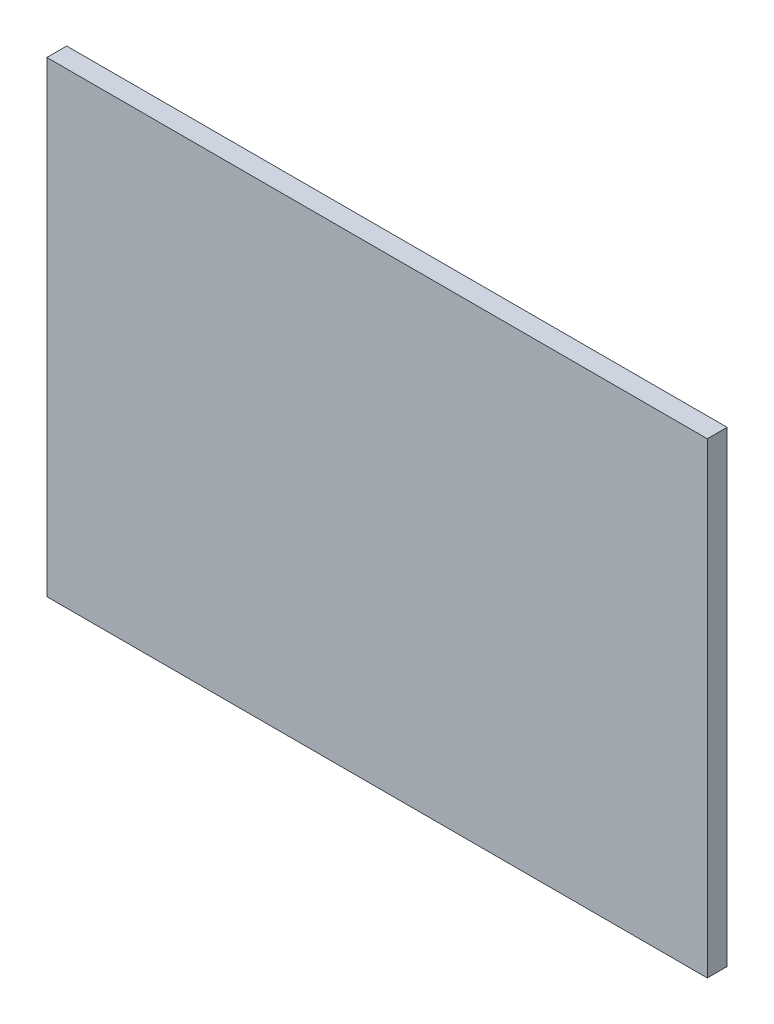
ISO-10303-21;
HEADER;
FILE_DESCRIPTION(('STEP AP214'),'2;1');
FILE_NAME('part.step','',(''),(''),'','','');
FILE_SCHEMA(('AUTOMOTIVE_DESIGN { 1 0 10303 214 1 1 1 1 }'));
ENDSEC;
DATA;
#1=APPLICATION_CONTEXT('core data for automotive mechanical design processes');
#2=APPLICATION_PROTOCOL_DEFINITION('international standard','automotive_design',2000,#1);
#3=PRODUCT_CONTEXT('',#1,'mechanical');
#4=PRODUCT('Part','Part','',(#3));
#5=PRODUCT_RELATED_PRODUCT_CATEGORY('part','',(#4));
#6=PRODUCT_DEFINITION_FORMATION('','',#4);
#7=PRODUCT_DEFINITION_CONTEXT('part definition',#1,'design');
#8=PRODUCT_DEFINITION('design','',#6,#7);
#9=PRODUCT_DEFINITION_SHAPE('','',#8);
#10=(LENGTH_UNIT() NAMED_UNIT(*) SI_UNIT(.MILLI.,.METRE.));
#11=(NAMED_UNIT(*) PLANE_ANGLE_UNIT() SI_UNIT($,.RADIAN.));
#12=(NAMED_UNIT(*) SI_UNIT($,.STERADIAN.) SOLID_ANGLE_UNIT());
#13=UNCERTAINTY_MEASURE_WITH_UNIT(LENGTH_MEASURE(1.E-05),#10,'distance_accuracy_value','');
#14=(GEOMETRIC_REPRESENTATION_CONTEXT(3) GLOBAL_UNCERTAINTY_ASSIGNED_CONTEXT((#13)) GLOBAL_UNIT_ASSIGNED_CONTEXT((#10,
#11,#12)) REPRESENTATION_CONTEXT('',''));
#15=CARTESIAN_POINT('',(0.,0.,0.));
#16=DIRECTION('',(0.,0.,1.));
#17=DIRECTION('',(1.,0.,0.));
#18=AXIS2_PLACEMENT_3D('',#15,#16,#17);
#19=CARTESIAN_POINT('',(15.,110.707070707071,3.));
#20=DIRECTION('',(1.,0.,0.));
#21=DIRECTION('',(0.,1.,0.));
#22=AXIS2_PLACEMENT_3D('',#19,#20,#21);
#23=PLANE('',#22);
#24=DIRECTION('',(0.,-1.,0.));
#25=VECTOR('',#24,1.);
#26=CARTESIAN_POINT('',(15.,110.707070707071,0.));
#27=LINE('',#26,#25);
#28=CARTESIAN_POINT('',(15.,110.707070707071,0.));
#29=VERTEX_POINT('',#28);
#30=CARTESIAN_POINT('',(15.,40.,0.));
#31=VERTEX_POINT('',#30);
#32=EDGE_CURVE('E101',#29,#31,#27,.T.);
#33=ORIENTED_EDGE('',*,*,#32,.T.);
#34=DIRECTION('',(0.,0.,-1.));
#35=VECTOR('',#34,1.);
#36=CARTESIAN_POINT('',(15.,40.,3.));
#37=LINE('',#36,#35);
#38=CARTESIAN_POINT('',(15.,40.,3.));
#39=VERTEX_POINT('',#38);
#40=EDGE_CURVE('E11',#39,#31,#37,.T.);
#41=ORIENTED_EDGE('',*,*,#40,.F.);
#42=DIRECTION('',(0.,-1.,0.));
#43=VECTOR('',#42,1.);
#44=CARTESIAN_POINT('',(15.,110.707070707071,3.));
#45=LINE('',#44,#43);
#46=CARTESIAN_POINT('',(15.,110.707070707071,3.));
#47=VERTEX_POINT('',#46);
#48=EDGE_CURVE('E89',#47,#39,#45,.T.);
#49=ORIENTED_EDGE('',*,*,#48,.F.);
#50=DIRECTION('',(0.,0.,-1.));
#51=VECTOR('',#50,1.);
#52=CARTESIAN_POINT('',(15.,110.707070707071,3.));
#53=LINE('',#52,#51);
#54=EDGE_CURVE('E97',#47,#29,#53,.T.);
#55=ORIENTED_EDGE('',*,*,#54,.T.);
#56=EDGE_LOOP('',(#33,#41,#49,#55));
#57=FACE_BOUND('',#56,.T.);
#58=ADVANCED_FACE('F38',(#57),#23,.F.);
#59=CARTESIAN_POINT('',(15.,40.,3.));
#60=DIRECTION('',(0.,1.,0.));
#61=DIRECTION('',(0.,0.,1.));
#62=AXIS2_PLACEMENT_3D('',#59,#60,#61);
#63=PLANE('',#62);
#64=DIRECTION('',(1.,0.,0.));
#65=VECTOR('',#64,1.);
#66=CARTESIAN_POINT('',(15.,40.,0.));
#67=LINE('',#66,#65);
#68=CARTESIAN_POINT('',(115.,40.,0.));
#69=VERTEX_POINT('',#68);
#70=EDGE_CURVE('E93',#31,#69,#67,.T.);
#71=ORIENTED_EDGE('',*,*,#70,.T.);
#72=DIRECTION('',(0.,0.,-1.));
#73=VECTOR('',#72,1.);
#74=CARTESIAN_POINT('',(115.,40.,3.));
#75=LINE('',#74,#73);
#76=CARTESIAN_POINT('',(115.,40.,3.));
#77=VERTEX_POINT('',#76);
#78=EDGE_CURVE('E46',#77,#69,#75,.T.);
#79=ORIENTED_EDGE('',*,*,#78,.F.);
#80=DIRECTION('',(1.,0.,0.));
#81=VECTOR('',#80,1.);
#82=CARTESIAN_POINT('',(15.,40.,3.));
#83=LINE('',#82,#81);
#84=EDGE_CURVE('E84',#39,#77,#83,.T.);
#85=ORIENTED_EDGE('',*,*,#84,.F.);
#86=ORIENTED_EDGE('',*,*,#40,.T.);
#87=EDGE_LOOP('',(#71,#79,#85,#86));
#88=FACE_BOUND('',#87,.T.);
#89=ADVANCED_FACE('F92',(#88),#63,.F.);
#90=CARTESIAN_POINT('',(115.,110.707070707071,3.));
#91=DIRECTION('',(-1.,0.,0.));
#92=DIRECTION('',(0.,-1.,0.));
#93=AXIS2_PLACEMENT_3D('',#90,#91,#92);
#94=PLANE('',#93);
#95=DIRECTION('',(0.,1.,0.));
#96=VECTOR('',#95,1.);
#97=CARTESIAN_POINT('',(115.,110.707070707071,0.));
#98=LINE('',#97,#96);
#99=CARTESIAN_POINT('',(115.,110.707070707071,0.));
#100=VERTEX_POINT('',#99);
#101=EDGE_CURVE('E71',#69,#100,#98,.T.);
#102=ORIENTED_EDGE('',*,*,#101,.T.);
#103=DIRECTION('',(0.,0.,-1.));
#104=VECTOR('',#103,1.);
#105=CARTESIAN_POINT('',(115.,110.707070707071,3.));
#106=LINE('',#105,#104);
#107=CARTESIAN_POINT('',(115.,110.707070707071,3.));
#108=VERTEX_POINT('',#107);
#109=EDGE_CURVE('E94',#108,#100,#106,.T.);
#110=ORIENTED_EDGE('',*,*,#109,.F.);
#111=DIRECTION('',(0.,1.,0.));
#112=VECTOR('',#111,1.);
#113=CARTESIAN_POINT('',(115.,110.707070707071,3.));
#114=LINE('',#113,#112);
#115=EDGE_CURVE('E87',#77,#108,#114,.T.);
#116=ORIENTED_EDGE('',*,*,#115,.F.);
#117=ORIENTED_EDGE('',*,*,#78,.T.);
#118=EDGE_LOOP('',(#102,#110,#116,#117));
#119=FACE_BOUND('',#118,.T.);
#120=ADVANCED_FACE('F95',(#119),#94,.F.);
#121=CARTESIAN_POINT('',(15.,110.707070707071,3.));
#122=DIRECTION('',(0.,-1.,0.));
#123=DIRECTION('',(0.,0.,-1.));
#124=AXIS2_PLACEMENT_3D('',#121,#122,#123);
#125=PLANE('',#124);
#126=DIRECTION('',(-1.,0.,0.));
#127=VECTOR('',#126,1.);
#128=CARTESIAN_POINT('',(15.,110.707070707071,0.));
#129=LINE('',#128,#127);
#130=EDGE_CURVE('E77',#100,#29,#129,.T.);
#131=ORIENTED_EDGE('',*,*,#130,.T.);
#132=ORIENTED_EDGE('',*,*,#54,.F.);
#133=DIRECTION('',(-1.,0.,0.));
#134=VECTOR('',#133,1.);
#135=CARTESIAN_POINT('',(15.,110.707070707071,3.));
#136=LINE('',#135,#134);
#137=EDGE_CURVE('E54',#108,#47,#136,.T.);
#138=ORIENTED_EDGE('',*,*,#137,.F.);
#139=ORIENTED_EDGE('',*,*,#109,.T.);
#140=EDGE_LOOP('',(#131,#132,#138,#139));
#141=FACE_BOUND('',#140,.T.);
#142=ADVANCED_FACE('F108',(#141),#125,.F.);
#143=CARTESIAN_POINT('',(0.,0.,3.));
#144=DIRECTION('',(0.,0.,1.));
#145=DIRECTION('',(1.,0.,0.));
#146=AXIS2_PLACEMENT_3D('',#143,#144,#145);
#147=PLANE('',#146);
#148=ORIENTED_EDGE('',*,*,#48,.T.);
#149=ORIENTED_EDGE('',*,*,#84,.T.);
#150=ORIENTED_EDGE('',*,*,#115,.T.);
#151=ORIENTED_EDGE('',*,*,#137,.T.);
#152=EDGE_LOOP('',(#148,#149,#150,#151));
#153=FACE_BOUND('',#152,.T.);
#154=ADVANCED_FACE('F85',(#153),#147,.T.);
#155=CARTESIAN_POINT('',(0.,0.,0.));
#156=DIRECTION('',(0.,0.,1.));
#157=DIRECTION('',(1.,0.,0.));
#158=AXIS2_PLACEMENT_3D('',#155,#156,#157);
#159=PLANE('',#158);
#160=ORIENTED_EDGE('',*,*,#32,.F.);
#161=ORIENTED_EDGE('',*,*,#130,.F.);
#162=ORIENTED_EDGE('',*,*,#101,.F.);
#163=ORIENTED_EDGE('',*,*,#70,.F.);
#164=EDGE_LOOP('',(#160,#161,#162,#163));
#165=FACE_BOUND('',#164,.T.);
#166=ADVANCED_FACE('F111',(#165),#159,.F.);
#167=CLOSED_SHELL('',(#58,#89,#120,#142,#154,#166));
#168=MANIFOLD_SOLID_BREP('B2',#167);
#169=ADVANCED_BREP_SHAPE_REPRESENTATION('',(#18,#168),#14);
#170=SHAPE_DEFINITION_REPRESENTATION(#9,#169);
ENDSEC;
END-ISO-10303-21;
